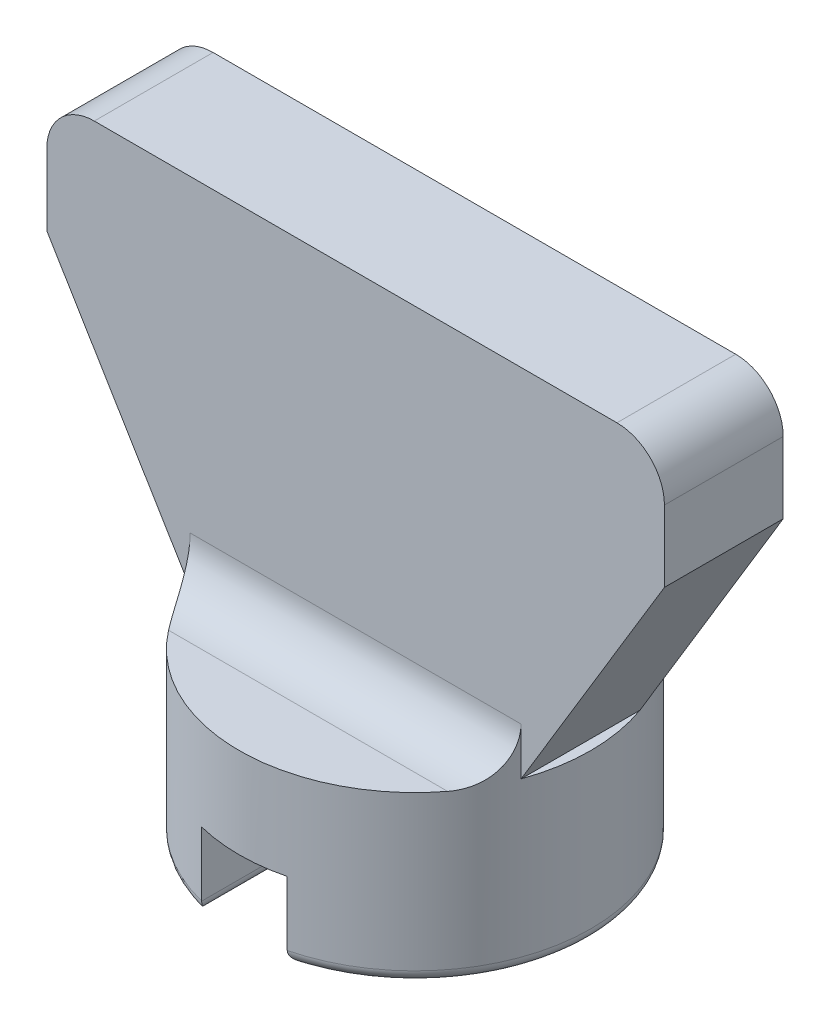
ISO-10303-21;
HEADER;
FILE_DESCRIPTION(('STEP AP214'),'2;1');
FILE_NAME('part.step','',(''),(''),'','','');
FILE_SCHEMA(('AUTOMOTIVE_DESIGN { 1 0 10303 214 1 1 1 1 }'));
ENDSEC;
DATA;
#1=APPLICATION_CONTEXT('core data for automotive mechanical design processes');
#2=APPLICATION_PROTOCOL_DEFINITION('international standard','automotive_design',2000,#1);
#3=PRODUCT_CONTEXT('',#1,'mechanical');
#4=PRODUCT('Part','Part','',(#3));
#5=PRODUCT_RELATED_PRODUCT_CATEGORY('part','',(#4));
#6=PRODUCT_DEFINITION_FORMATION('','',#4);
#7=PRODUCT_DEFINITION_CONTEXT('part definition',#1,'design');
#8=PRODUCT_DEFINITION('design','',#6,#7);
#9=PRODUCT_DEFINITION_SHAPE('','',#8);
#10=(LENGTH_UNIT() NAMED_UNIT(*) SI_UNIT(.MILLI.,.METRE.));
#11=(NAMED_UNIT(*) PLANE_ANGLE_UNIT() SI_UNIT($,.RADIAN.));
#12=(NAMED_UNIT(*) SI_UNIT($,.STERADIAN.) SOLID_ANGLE_UNIT());
#13=UNCERTAINTY_MEASURE_WITH_UNIT(LENGTH_MEASURE(1.E-05),#10,'distance_accuracy_value','');
#14=(GEOMETRIC_REPRESENTATION_CONTEXT(3) GLOBAL_UNCERTAINTY_ASSIGNED_CONTEXT((#13)) GLOBAL_UNIT_ASSIGNED_CONTEXT((#10,
#11,#12)) REPRESENTATION_CONTEXT('',''));
#15=CARTESIAN_POINT('',(0.,0.,0.));
#16=DIRECTION('',(0.,0.,1.));
#17=DIRECTION('',(1.,0.,0.));
#18=AXIS2_PLACEMENT_3D('',#15,#16,#17);
#19=CARTESIAN_POINT('',(0.,7.,0.));
#20=DIRECTION('',(0.,1.,0.));
#21=DIRECTION('',(0.,0.,1.));
#22=AXIS2_PLACEMENT_3D('',#19,#20,#21);
#23=PLANE('',#22);
#24=CARTESIAN_POINT('',(0.,7.,0.));
#25=DIRECTION('',(0.,1.,0.));
#26=DIRECTION('',(0.,0.,1.));
#27=AXIS2_PLACEMENT_3D('',#24,#25,#26);
#28=CIRCLE('',#27,7.4);
#29=CARTESIAN_POINT('',(5.87452125708981,7.,-4.5));
#30=VERTEX_POINT('',#29);
#31=CARTESIAN_POINT('',(-5.87452125708981,7.,-4.5));
#32=VERTEX_POINT('',#31);
#33=EDGE_CURVE('E260',#30,#32,#28,.T.);
#34=ORIENTED_EDGE('',*,*,#33,.T.);
#35=DIRECTION('',(-1.,0.,0.));
#36=VECTOR('',#35,1.);
#37=CARTESIAN_POINT('',(0.,7.,-4.5));
#38=LINE('',#37,#36);
#39=EDGE_CURVE('E378',#32,#30,#38,.F.);
#40=ORIENTED_EDGE('',*,*,#39,.T.);
#41=EDGE_LOOP('',(#34,#40));
#42=FACE_BOUND('',#41,.T.);
#43=ADVANCED_FACE('F39',(#42),#23,.T.);
#44=CARTESIAN_POINT('',(0.,0.,0.));
#45=DIRECTION('',(0.,1.,0.));
#46=DIRECTION('',(0.,0.,1.));
#47=AXIS2_PLACEMENT_3D('',#44,#45,#46);
#48=PLANE('',#47);
#49=CARTESIAN_POINT('',(0.,0.,0.));
#50=DIRECTION('',(0.,1.,0.));
#51=DIRECTION('',(0.,0.,1.));
#52=AXIS2_PLACEMENT_3D('',#49,#50,#51);
#53=CIRCLE('',#52,6.9);
#54=CARTESIAN_POINT('',(-2.3,0.,6.50538238691624));
#55=VERTEX_POINT('',#54);
#56=CARTESIAN_POINT('',(-2.3,0.,-6.50538238691624));
#57=VERTEX_POINT('',#56);
#58=EDGE_CURVE('E266',#55,#57,#53,.F.);
#59=ORIENTED_EDGE('',*,*,#58,.T.);
#60=DIRECTION('',(0.,0.,1.));
#61=VECTOR('',#60,1.);
#62=CARTESIAN_POINT('',(-2.3,0.,0.));
#63=LINE('',#62,#61);
#64=EDGE_CURVE('E269',#57,#55,#63,.T.);
#65=ORIENTED_EDGE('',*,*,#64,.T.);
#66=EDGE_LOOP('',(#59,#65));
#67=FACE_BOUND('',#66,.T.);
#68=ADVANCED_FACE('F426',(#67),#48,.F.);
#69=CARTESIAN_POINT('',(0.,7.,0.));
#70=DIRECTION('',(0.,-1.,0.));
#71=DIRECTION('',(0.,0.,-1.));
#72=AXIS2_PLACEMENT_3D('',#69,#70,#71);
#73=CYLINDRICAL_SURFACE('',#72,7.4);
#74=DIRECTION('',(0.,-1.,0.));
#75=VECTOR('',#74,1.);
#76=CARTESIAN_POINT('',(1.8,7.,7.17774337797054));
#77=LINE('',#76,#75);
#78=CARTESIAN_POINT('',(1.8,3.2,7.17774337797054));
#79=VERTEX_POINT('',#78);
#80=CARTESIAN_POINT('',(1.8,0.5,7.17774337797054));
#81=VERTEX_POINT('',#80);
#82=EDGE_CURVE('E243',#79,#81,#77,.T.);
#83=ORIENTED_EDGE('',*,*,#82,.T.);
#84=CARTESIAN_POINT('',(0.,0.5,0.));
#85=DIRECTION('',(0.,1.,0.));
#86=DIRECTION('',(0.,0.,1.));
#87=AXIS2_PLACEMENT_3D('',#84,#85,#86);
#88=CIRCLE('',#87,7.4);
#89=CARTESIAN_POINT('',(1.8,0.5,-7.17774337797054));
#90=VERTEX_POINT('',#89);
#91=EDGE_CURVE('E291',#81,#90,#88,.T.);
#92=ORIENTED_EDGE('',*,*,#91,.T.);
#93=DIRECTION('',(0.,-1.,0.));
#94=VECTOR('',#93,1.);
#95=CARTESIAN_POINT('',(1.8,7.,-7.17774337797054));
#96=LINE('',#95,#94);
#97=CARTESIAN_POINT('',(1.8,3.2,-7.17774337797054));
#98=VERTEX_POINT('',#97);
#99=EDGE_CURVE('E240',#90,#98,#96,.F.);
#100=ORIENTED_EDGE('',*,*,#99,.T.);
#101=CARTESIAN_POINT('',(0.,3.2,0.));
#102=DIRECTION('',(0.,-1.,0.));
#103=DIRECTION('',(0.,0.,-1.));
#104=AXIS2_PLACEMENT_3D('',#101,#102,#103);
#105=CIRCLE('',#104,7.4);
#106=CARTESIAN_POINT('',(-1.8,3.2,-7.17774337797054));
#107=VERTEX_POINT('',#106);
#108=EDGE_CURVE('E259',#107,#98,#105,.T.);
#109=ORIENTED_EDGE('',*,*,#108,.F.);
#110=DIRECTION('',(0.,-1.,0.));
#111=VECTOR('',#110,1.);
#112=CARTESIAN_POINT('',(-1.8,7.,-7.17774337797054));
#113=LINE('',#112,#111);
#114=CARTESIAN_POINT('',(-1.8,0.5,-7.17774337797054));
#115=VERTEX_POINT('',#114);
#116=EDGE_CURVE('E250',#107,#115,#113,.T.);
#117=ORIENTED_EDGE('',*,*,#116,.T.);
#118=CARTESIAN_POINT('',(0.,0.5,0.));
#119=DIRECTION('',(0.,1.,0.));
#120=DIRECTION('',(0.,0.,1.));
#121=AXIS2_PLACEMENT_3D('',#118,#119,#120);
#122=CIRCLE('',#121,7.4);
#123=CARTESIAN_POINT('',(-1.8,0.5,7.17774337797054));
#124=VERTEX_POINT('',#123);
#125=EDGE_CURVE('E288',#115,#124,#122,.T.);
#126=ORIENTED_EDGE('',*,*,#125,.T.);
#127=DIRECTION('',(0.,-1.,0.));
#128=VECTOR('',#127,1.);
#129=CARTESIAN_POINT('',(-1.8,7.,7.17774337797054));
#130=LINE('',#129,#128);
#131=CARTESIAN_POINT('',(-1.8,3.2,7.17774337797054));
#132=VERTEX_POINT('',#131);
#133=EDGE_CURVE('E247',#124,#132,#130,.F.);
#134=ORIENTED_EDGE('',*,*,#133,.T.);
#135=EDGE_CURVE('E265',#79,#132,#105,.T.);
#136=ORIENTED_EDGE('',*,*,#135,.F.);
#137=EDGE_LOOP('',(#83,#92,#100,#109,#117,#126,#134,#136));
#138=FACE_BOUND('',#137,.T.);
#139=CARTESIAN_POINT('',(6.96491205974633,7.,2.5));
#140=VERTEX_POINT('',#139);
#141=CARTESIAN_POINT('',(6.96491205974634,7.,-2.5));
#142=VERTEX_POINT('',#141);
#143=EDGE_CURVE('E255',#140,#142,#28,.T.);
#144=ORIENTED_EDGE('',*,*,#143,.F.);
#145=DIRECTION('',(0.,-1.,0.));
#146=VECTOR('',#145,1.);
#147=CARTESIAN_POINT('',(6.96491205974634,9.,2.5));
#148=LINE('',#147,#146);
#149=CARTESIAN_POINT('',(6.96491205974634,9.,2.5));
#150=VERTEX_POINT('',#149);
#151=EDGE_CURVE('E386',#150,#140,#148,.T.);
#152=ORIENTED_EDGE('',*,*,#151,.F.);
#153=CARTESIAN_POINT('',(6.96491205974634,9.,2.5));
#154=CARTESIAN_POINT('',(6.96490988978013,8.94675930102622,2.49999324196655));
#155=CARTESIAN_POINT('',(6.96414888439135,8.89352122674711,2.50212584481326));
#156=CARTESIAN_POINT('',(6.96109422611455,8.7874315823194,2.51061834560592));
#157=CARTESIAN_POINT('',(6.95880069166677,8.73457998262151,2.51697791687394));
#158=CARTESIAN_POINT('',(6.95267052696719,8.62971358798291,2.53386048338014));
#159=CARTESIAN_POINT('',(6.94883617761764,8.57769767380806,2.54437732414731));
#160=CARTESIAN_POINT('',(6.93960012029549,8.47480906857302,2.56946049103761));
#161=CARTESIAN_POINT('',(6.93419842630519,8.42393636731859,2.58402678103552));
#162=CARTESIAN_POINT('',(6.91558365363915,8.27353525793228,2.63362281453332));
#163=CARTESIAN_POINT('',(6.89995774589194,8.17616810758799,2.67455881596779));
#164=CARTESIAN_POINT('',(6.86199335441583,7.99014245719123,2.77050334281339));
#165=CARTESIAN_POINT('',(6.8396549130166,7.90148390222647,2.82551177948252));
#166=CARTESIAN_POINT('',(6.78778017756616,7.7342959734019,2.94796316639501));
#167=CARTESIAN_POINT('',(6.75818136041623,7.65586417083466,3.01551281677794));
#168=CARTESIAN_POINT('',(6.69184414332996,7.51178591818151,3.15998829325583));
#169=CARTESIAN_POINT('',(6.65510744864724,7.44613642186134,3.23691187826532));
#170=CARTESIAN_POINT('',(6.57294844097474,7.32595769934133,3.40074974361043));
#171=CARTESIAN_POINT('',(6.52721800484832,7.27203585928601,3.48795294856934));
#172=CARTESIAN_POINT('',(6.42864395144979,7.17918791628063,3.6664611399044));
#173=CARTESIAN_POINT('',(6.37578676850216,7.14029097256464,3.75777372200824));
#174=CARTESIAN_POINT('',(6.28655323023605,7.08990496054369,3.9042759709517));
#175=CARTESIAN_POINT('',(6.25216766895552,7.07369509453945,3.95912415159776));
#176=CARTESIAN_POINT('',(6.18136082946984,7.04622182956156,4.06878772350242));
#177=CARTESIAN_POINT('',(6.14493873277212,7.03496043574412,4.12360309249762));
#178=CARTESIAN_POINT('',(6.07041663941957,7.01719892934642,4.23253795558525));
#179=CARTESIAN_POINT('',(6.03232351036068,7.01068096872967,4.2866592975408));
#180=CARTESIAN_POINT('',(5.95456240759327,7.00208339574914,4.39404147764273));
#181=CARTESIAN_POINT('',(5.91489598385101,6.99999952049798,4.44730309337563));
#182=CARTESIAN_POINT('',(5.87452125708981,7.,4.5));
#183=B_SPLINE_CURVE_WITH_KNOTS('',3,(#153,#154,#155,#156,#157,#158,#159,#160,#161,#162,#163,
#164,#165,#166,#167,#168,#169,#170,#171,#172,#173,#174,#175,#176,#177,#178,#179,#180,#181,#182),
.UNSPECIFIED.,.F.,.F.,(4,2,2,2,2,2,2,2,2,2,2,2,2,2,4),(0.,0.159669295122695,0.319326251763545,
0.478747730250413,0.638167786580154,0.956840362260378,1.27551092841289,1.59702851878191,
1.91846939217174,2.25388204014957,2.58994240092548,2.78995410546787,2.99004678160974,
3.18938262387402,3.38852673981185),.UNSPECIFIED.);
#184=CARTESIAN_POINT('',(5.87452125708981,7.,4.5));
#185=VERTEX_POINT('',#184);
#186=EDGE_CURVE('E54',#150,#185,#183,.T.);
#187=ORIENTED_EDGE('',*,*,#186,.T.);
#188=CARTESIAN_POINT('',(-5.87452125708981,7.,4.5));
#189=VERTEX_POINT('',#188);
#190=EDGE_CURVE('E254',#189,#185,#28,.T.);
#191=ORIENTED_EDGE('',*,*,#190,.F.);
#192=CARTESIAN_POINT('',(-5.87452125708981,7.,4.5));
#193=CARTESIAN_POINT('',(-5.91796801386442,6.9999991834551,4.44329639671849));
#194=CARTESIAN_POINT('',(-5.96059472769925,7.00241245073197,4.38593469153333));
#195=CARTESIAN_POINT('',(-6.04401764826374,7.01239231594789,4.27023545658228));
#196=CARTESIAN_POINT('',(-6.08481160948166,7.0199650611686,4.21189684384249));
#197=CARTESIAN_POINT('',(-6.16445491991691,7.0406376071566,4.09445431836809));
#198=CARTESIAN_POINT('',(-6.20329455320997,7.05376245439857,4.03534812891109));
#199=CARTESIAN_POINT('',(-6.27855603918139,7.08581073538654,3.91722414561329));
#200=CARTESIAN_POINT('',(-6.31497908449994,7.10473128253491,3.8582063224322));
#201=CARTESIAN_POINT('',(-6.40923167392326,7.16365035216726,3.70066902879307));
#202=CARTESIAN_POINT('',(-6.46468103813618,7.20921724343025,3.6027154132706));
#203=CARTESIAN_POINT('',(-6.56704834782756,7.31790910273603,3.41255572522256));
#204=CARTESIAN_POINT('',(-6.61398556238313,7.38099357464982,3.3203369898363));
#205=CARTESIAN_POINT('',(-6.69915586471784,7.52459864492555,3.14497550815573));
#206=CARTESIAN_POINT('',(-6.73734199747061,7.60520897971785,3.06188291398103));
#207=CARTESIAN_POINT('',(-6.80456721698494,7.78191638891899,2.90943979177736));
#208=CARTESIAN_POINT('',(-6.83360240146494,7.87802004388355,2.84009513100693));
#209=CARTESIAN_POINT('',(-6.88064974994819,8.07386917782467,2.72401451246059));
#210=CARTESIAN_POINT('',(-6.8993933443719,8.17259669956638,2.67585027903208));
#211=CARTESIAN_POINT('',(-6.92977272952859,8.3775258863395,2.59616695046479));
#212=CARTESIAN_POINT('',(-6.94141578958072,8.48371978283386,2.56463083643971));
#213=CARTESIAN_POINT('',(-6.95477599411233,8.65894027581597,2.52810352734734));
#214=CARTESIAN_POINT('',(-6.95858484642658,8.72671023114583,2.517576407376));
#215=CARTESIAN_POINT('',(-6.96364741761588,8.86297562887335,2.50352395879054));
#216=CARTESIAN_POINT('',(-6.96490450804284,8.93146999362211,2.49998939132345));
#217=CARTESIAN_POINT('',(-6.96491205974634,9.,2.5));
#218=B_SPLINE_CURVE_WITH_KNOTS('',3,(#192,#193,#194,#195,#196,#197,#198,#199,#200,#201,#202,
#203,#204,#205,#206,#207,#208,#209,#210,#211,#212,#213,#214,#215,#216,#217),.UNSPECIFIED.,.F.,
.F.,(4,2,2,2,2,2,2,2,2,2,2,2,4),(0.,0.214290136274398,0.428836036946061,0.644360289173684,
0.859777371770655,1.22239928142621,1.58418978323103,1.94787829469435,2.31172168635833,
2.64438332701008,2.97670382417658,3.18239372982334,3.38781168737558),.UNSPECIFIED.);
#219=CARTESIAN_POINT('',(-6.96491205974634,9.,2.5));
#220=VERTEX_POINT('',#219);
#221=EDGE_CURVE('E11',#189,#220,#218,.T.);
#222=ORIENTED_EDGE('',*,*,#221,.T.);
#223=DIRECTION('',(0.,-1.,0.));
#224=VECTOR('',#223,1.);
#225=CARTESIAN_POINT('',(-6.96491205974634,7.,2.5));
#226=LINE('',#225,#224);
#227=CARTESIAN_POINT('',(-6.96491205974634,7.,2.5));
#228=VERTEX_POINT('',#227);
#229=EDGE_CURVE('E60',#228,#220,#226,.F.);
#230=ORIENTED_EDGE('',*,*,#229,.F.);
#231=CARTESIAN_POINT('',(-6.96491205974634,7.,-2.5));
#232=VERTEX_POINT('',#231);
#233=EDGE_CURVE('E261',#232,#228,#28,.T.);
#234=ORIENTED_EDGE('',*,*,#233,.F.);
#235=DIRECTION('',(0.,-1.,0.));
#236=VECTOR('',#235,1.);
#237=CARTESIAN_POINT('',(-6.96491205974634,9.,-2.5));
#238=LINE('',#237,#236);
#239=CARTESIAN_POINT('',(-6.96491205974634,9.,-2.5));
#240=VERTEX_POINT('',#239);
#241=EDGE_CURVE('E375',#240,#232,#238,.T.);
#242=ORIENTED_EDGE('',*,*,#241,.F.);
#243=CARTESIAN_POINT('',(-6.96491205974634,9.,-2.5));
#244=CARTESIAN_POINT('',(-6.96490988978013,8.94675930102622,-2.49999324196655));
#245=CARTESIAN_POINT('',(-6.96414888439135,8.89352122674711,-2.50212584481326));
#246=CARTESIAN_POINT('',(-6.96109422611455,8.7874315823194,-2.51061834560592));
#247=CARTESIAN_POINT('',(-6.95880069166677,8.73457998262151,-2.51697791687394));
#248=CARTESIAN_POINT('',(-6.95267052696719,8.62971358798291,-2.53386048338014));
#249=CARTESIAN_POINT('',(-6.94883617761764,8.57769767380806,-2.54437732414731));
#250=CARTESIAN_POINT('',(-6.93960012029549,8.47480906857302,-2.56946049103761));
#251=CARTESIAN_POINT('',(-6.93419842630519,8.42393636731859,-2.58402678103552));
#252=CARTESIAN_POINT('',(-6.91558365363915,8.27353525793228,-2.63362281453332));
#253=CARTESIAN_POINT('',(-6.89995774589194,8.17616810758799,-2.67455881596779));
#254=CARTESIAN_POINT('',(-6.86199335441583,7.99014245719123,-2.77050334281339));
#255=CARTESIAN_POINT('',(-6.8396549130166,7.90148390222647,-2.82551177948252));
#256=CARTESIAN_POINT('',(-6.78778017756616,7.7342959734019,-2.94796316639501));
#257=CARTESIAN_POINT('',(-6.75818136041623,7.65586417083466,-3.01551281677794));
#258=CARTESIAN_POINT('',(-6.69184414332996,7.51178591818151,-3.15998829325583));
#259=CARTESIAN_POINT('',(-6.65510744864724,7.44613642186134,-3.23691187826532));
#260=CARTESIAN_POINT('',(-6.57294844097474,7.32595769934133,-3.40074974361043));
#261=CARTESIAN_POINT('',(-6.52721800484832,7.27203585928601,-3.48795294856934));
#262=CARTESIAN_POINT('',(-6.42864395144979,7.17918791628063,-3.6664611399044));
#263=CARTESIAN_POINT('',(-6.37578676850216,7.14029097256464,-3.75777372200824));
#264=CARTESIAN_POINT('',(-6.28655323023605,7.08990496054369,-3.9042759709517));
#265=CARTESIAN_POINT('',(-6.25216766895552,7.07369509453945,-3.95912415159776));
#266=CARTESIAN_POINT('',(-6.18136082946984,7.04622182956156,-4.06878772350242));
#267=CARTESIAN_POINT('',(-6.14493873277212,7.03496043574412,-4.12360309249762));
#268=CARTESIAN_POINT('',(-6.07041663941957,7.01719892934642,-4.23253795558525));
#269=CARTESIAN_POINT('',(-6.03232351036068,7.01068096872967,-4.2866592975408));
#270=CARTESIAN_POINT('',(-5.95456240759327,7.00208339574914,-4.39404147764273));
#271=CARTESIAN_POINT('',(-5.91489598385101,6.99999952049798,-4.44730309337563));
#272=CARTESIAN_POINT('',(-5.87452125708981,7.,-4.5));
#273=B_SPLINE_CURVE_WITH_KNOTS('',3,(#243,#244,#245,#246,#247,#248,#249,#250,#251,#252,#253,
#254,#255,#256,#257,#258,#259,#260,#261,#262,#263,#264,#265,#266,#267,#268,#269,#270,#271,#272),
.UNSPECIFIED.,.F.,.F.,(4,2,2,2,2,2,2,2,2,2,2,2,2,2,4),(0.,0.159669295122695,0.319326251763545,
0.478747730250413,0.638167786580154,0.956840362260378,1.27551092841289,1.59702851878191,
1.91846939217174,2.25388204014957,2.58994240092548,2.78995410546787,2.99004678160974,
3.18938262387402,3.38852673981185),.UNSPECIFIED.);
#274=EDGE_CURVE('E392',#240,#32,#273,.T.);
#275=ORIENTED_EDGE('',*,*,#274,.T.);
#276=ORIENTED_EDGE('',*,*,#33,.F.);
#277=CARTESIAN_POINT('',(5.87452125708981,7.,-4.5));
#278=CARTESIAN_POINT('',(5.91796801386442,6.9999991834551,-4.44329639671849));
#279=CARTESIAN_POINT('',(5.96059472769925,7.00241245073197,-4.38593469153333));
#280=CARTESIAN_POINT('',(6.04401764826374,7.01239231594789,-4.27023545658228));
#281=CARTESIAN_POINT('',(6.08481160948166,7.0199650611686,-4.21189684384249));
#282=CARTESIAN_POINT('',(6.16445491991691,7.0406376071566,-4.09445431836809));
#283=CARTESIAN_POINT('',(6.20329455320997,7.05376245439857,-4.03534812891109));
#284=CARTESIAN_POINT('',(6.27855603918139,7.08581073538654,-3.91722414561329));
#285=CARTESIAN_POINT('',(6.31497908449994,7.10473128253491,-3.8582063224322));
#286=CARTESIAN_POINT('',(6.40923167392326,7.16365035216726,-3.70066902879307));
#287=CARTESIAN_POINT('',(6.46468103813618,7.20921724343025,-3.6027154132706));
#288=CARTESIAN_POINT('',(6.56704834782756,7.31790910273603,-3.41255572522256));
#289=CARTESIAN_POINT('',(6.61398556238313,7.38099357464982,-3.3203369898363));
#290=CARTESIAN_POINT('',(6.69915586471784,7.52459864492555,-3.14497550815573));
#291=CARTESIAN_POINT('',(6.73734199747061,7.60520897971785,-3.06188291398103));
#292=CARTESIAN_POINT('',(6.80456721698494,7.78191638891899,-2.90943979177736));
#293=CARTESIAN_POINT('',(6.83360240146494,7.87802004388355,-2.84009513100693));
#294=CARTESIAN_POINT('',(6.88064974994819,8.07386917782467,-2.72401451246059));
#295=CARTESIAN_POINT('',(6.8993933443719,8.17259669956638,-2.67585027903208));
#296=CARTESIAN_POINT('',(6.92977272952859,8.3775258863395,-2.59616695046479));
#297=CARTESIAN_POINT('',(6.94141578958072,8.48371978283386,-2.56463083643971));
#298=CARTESIAN_POINT('',(6.95477599411233,8.65894027581597,-2.52810352734734));
#299=CARTESIAN_POINT('',(6.95858484642658,8.72671023114583,-2.517576407376));
#300=CARTESIAN_POINT('',(6.96364741761588,8.86297562887335,-2.50352395879054));
#301=CARTESIAN_POINT('',(6.96490450804284,8.93146999362211,-2.49998939132345));
#302=CARTESIAN_POINT('',(6.96491205974634,9.,-2.5));
#303=B_SPLINE_CURVE_WITH_KNOTS('',3,(#277,#278,#279,#280,#281,#282,#283,#284,#285,#286,#287,
#288,#289,#290,#291,#292,#293,#294,#295,#296,#297,#298,#299,#300,#301,#302),.UNSPECIFIED.,.F.,
.F.,(4,2,2,2,2,2,2,2,2,2,2,2,4),(0.,0.214290136274398,0.428836036946061,0.644360289173684,
0.859777371770655,1.22239928142621,1.58418978323103,1.94787829469435,2.31172168635833,
2.64438332701008,2.97670382417658,3.18239372982334,3.38781168737558),.UNSPECIFIED.);
#304=CARTESIAN_POINT('',(6.96491205974634,9.,-2.5));
#305=VERTEX_POINT('',#304);
#306=EDGE_CURVE('E399',#30,#305,#303,.T.);
#307=ORIENTED_EDGE('',*,*,#306,.T.);
#308=DIRECTION('',(0.,-1.,0.));
#309=VECTOR('',#308,1.);
#310=CARTESIAN_POINT('',(6.96491205974634,7.,-2.5));
#311=LINE('',#310,#309);
#312=EDGE_CURVE('E67',#142,#305,#311,.F.);
#313=ORIENTED_EDGE('',*,*,#312,.F.);
#314=EDGE_LOOP('',(#144,#152,#187,#191,#222,#230,#234,#242,#275,#276,#307,#313));
#315=FACE_BOUND('',#314,.T.);
#316=ADVANCED_FACE('F404',(#138,#315),#73,.T.);
#317=ORIENTED_EDGE('',*,*,#190,.T.);
#318=DIRECTION('',(1.,0.,0.));
#319=VECTOR('',#318,1.);
#320=CARTESIAN_POINT('',(0.,7.,4.5));
#321=LINE('',#320,#319);
#322=EDGE_CURVE('E389',#185,#189,#321,.F.);
#323=ORIENTED_EDGE('',*,*,#322,.T.);
#324=EDGE_LOOP('',(#317,#323));
#325=FACE_BOUND('',#324,.T.);
#326=ADVANCED_FACE('F429',(#325),#23,.T.);
#327=CARTESIAN_POINT('',(0.,0.,0.));
#328=DIRECTION('',(0.,1.,0.));
#329=DIRECTION('',(0.,0.,1.));
#330=AXIS2_PLACEMENT_3D('',#327,#328,#329);
#331=CIRCLE('',#330,6.9);
#332=CARTESIAN_POINT('',(2.3,0.,-6.50538238691624));
#333=VERTEX_POINT('',#332);
#334=CARTESIAN_POINT('',(2.3,0.,6.50538238691624));
#335=VERTEX_POINT('',#334);
#336=EDGE_CURVE('E277',#333,#335,#331,.F.);
#337=ORIENTED_EDGE('',*,*,#336,.T.);
#338=DIRECTION('',(0.,0.,-1.));
#339=VECTOR('',#338,1.);
#340=CARTESIAN_POINT('',(2.3,0.,0.));
#341=LINE('',#340,#339);
#342=EDGE_CURVE('E280',#335,#333,#341,.T.);
#343=ORIENTED_EDGE('',*,*,#342,.T.);
#344=EDGE_LOOP('',(#337,#343));
#345=FACE_BOUND('',#344,.T.);
#346=ADVANCED_FACE('F434',(#345),#48,.F.);
#347=CARTESIAN_POINT('',(0.,3.2,0.));
#348=DIRECTION('',(0.,-1.,0.));
#349=DIRECTION('',(0.,0.,-1.));
#350=AXIS2_PLACEMENT_3D('',#347,#348,#349);
#351=PLANE('',#350);
#352=ORIENTED_EDGE('',*,*,#135,.T.);
#353=DIRECTION('',(0.,0.,-1.));
#354=VECTOR('',#353,1.);
#355=CARTESIAN_POINT('',(-1.8,3.2,8.0374463788754));
#356=LINE('',#355,#354);
#357=EDGE_CURVE('E231',#132,#107,#356,.T.);
#358=ORIENTED_EDGE('',*,*,#357,.T.);
#359=ORIENTED_EDGE('',*,*,#108,.T.);
#360=DIRECTION('',(0.,0.,1.));
#361=VECTOR('',#360,1.);
#362=CARTESIAN_POINT('',(1.8,3.2,8.0374463788754));
#363=LINE('',#362,#361);
#364=EDGE_CURVE('E235',#98,#79,#363,.T.);
#365=ORIENTED_EDGE('',*,*,#364,.T.);
#366=EDGE_LOOP('',(#352,#358,#359,#365));
#367=FACE_BOUND('',#366,.T.);
#368=ADVANCED_FACE('F443',(#367),#351,.T.);
#369=CARTESIAN_POINT('',(-1.8,3.2,8.0374463788754));
#370=DIRECTION('',(-1.,0.,0.));
#371=DIRECTION('',(0.,0.,1.));
#372=AXIS2_PLACEMENT_3D('',#369,#370,#371);
#373=PLANE('',#372);
#374=ORIENTED_EDGE('',*,*,#133,.F.);
#375=DIRECTION('',(0.,0.,1.));
#376=VECTOR('',#375,1.);
#377=CARTESIAN_POINT('',(-1.8,0.5,8.0374463788754));
#378=LINE('',#377,#376);
#379=EDGE_CURVE('E273',#124,#115,#378,.F.);
#380=ORIENTED_EDGE('',*,*,#379,.T.);
#381=ORIENTED_EDGE('',*,*,#116,.F.);
#382=ORIENTED_EDGE('',*,*,#357,.F.);
#383=EDGE_LOOP('',(#374,#380,#381,#382));
#384=FACE_BOUND('',#383,.T.);
#385=ADVANCED_FACE('F498',(#384),#373,.F.);
#386=CARTESIAN_POINT('',(1.8,3.2,8.0374463788754));
#387=DIRECTION('',(1.,0.,0.));
#388=DIRECTION('',(0.,0.,-1.));
#389=AXIS2_PLACEMENT_3D('',#386,#387,#388);
#390=PLANE('',#389);
#391=ORIENTED_EDGE('',*,*,#99,.F.);
#392=DIRECTION('',(0.,0.,-1.));
#393=VECTOR('',#392,1.);
#394=CARTESIAN_POINT('',(1.8,0.5,8.0374463788754));
#395=LINE('',#394,#393);
#396=EDGE_CURVE('E284',#90,#81,#395,.F.);
#397=ORIENTED_EDGE('',*,*,#396,.T.);
#398=ORIENTED_EDGE('',*,*,#82,.F.);
#399=ORIENTED_EDGE('',*,*,#364,.F.);
#400=EDGE_LOOP('',(#391,#397,#398,#399));
#401=FACE_BOUND('',#400,.T.);
#402=ADVANCED_FACE('F316',(#401),#390,.F.);
#403=CARTESIAN_POINT('',(0.,0.5,0.));
#404=DIRECTION('',(0.,1.,0.));
#405=DIRECTION('',(0.,0.,1.));
#406=AXIS2_PLACEMENT_3D('',#403,#404,#405);
#407=TOROIDAL_SURFACE('',#406,6.9,0.5);
#408=CARTESIAN_POINT('',(-1.8,0.5,7.17774337797054));
#409=CARTESIAN_POINT('',(-1.79996099619526,0.479244253497925,7.1777915470728));
#410=CARTESIAN_POINT('',(-1.80128974707324,0.458564245434219,7.17609034804468));
#411=CARTESIAN_POINT('',(-1.80633010227469,0.4182207503747,7.16962641330162));
#412=CARTESIAN_POINT('',(-1.8100144487914,0.398548380569583,7.16489869817358));
#413=CARTESIAN_POINT('',(-1.81940803160352,0.360662810524451,7.15282642642886));
#414=CARTESIAN_POINT('',(-1.82510888827748,0.342443948506235,7.14549269854457));
#415=CARTESIAN_POINT('',(-1.83812919234911,0.307588753293909,7.12870915844284));
#416=CARTESIAN_POINT('',(-1.84545349314725,0.290957383934168,7.11925299997664));
#417=CARTESIAN_POINT('',(-1.86543377874319,0.251262897760324,7.09339539953549));
#418=CARTESIAN_POINT('',(-1.87889212645429,0.22930267413956,7.07592624095862));
#419=CARTESIAN_POINT('',(-1.90764118331982,0.189085812389894,7.03844849651268));
#420=CARTESIAN_POINT('',(-1.92293579809843,0.170837298976136,7.01843449238235));
#421=CARTESIAN_POINT('',(-1.96395313486751,0.127982171468994,6.96450614968511));
#422=CARTESIAN_POINT('',(-1.99055749560738,0.105870198762608,6.92928978886352));
#423=CARTESIAN_POINT('',(-2.04516023515169,0.0685478740345926,6.85641249851014));
#424=CARTESIAN_POINT('',(-2.07316141113824,0.0533520424142022,6.81874661384666));
#425=CARTESIAN_POINT('',(-2.13384402670446,0.0270962960082887,6.73640850616222));
#426=CARTESIAN_POINT('',(-2.1666145767938,0.0169575726213458,6.69151320387429));
#427=CARTESIAN_POINT('',(-2.2321218904664,0.00350529187784368,6.60083414412866));
#428=CARTESIAN_POINT('',(-2.26485860858889,0.000179474020963785,6.55505213259642));
#429=CARTESIAN_POINT('',(-2.29822708502071,2.36734961008698E-06,6.50788930675039));
#430=CARTESIAN_POINT('',(-2.2991136402507,1.10354455115264E-08,6.50663589072227));
#431=CARTESIAN_POINT('',(-2.3,0.,6.50538238691624));
#432=B_SPLINE_CURVE_WITH_KNOTS('',3,(#408,#409,#410,#411,#412,#413,#414,#415,#416,#417,#418,
#419,#420,#421,#422,#423,#424,#425,#426,#427,#428,#429,#430,#431),.UNSPECIFIED.,.F.,.F.,(4,2,2,
2,2,2,2,2,2,2,2,4),(0.,0.062035265181198,0.123365369706317,0.184443554082017,0.245706859707081,
0.338544736055139,0.431583692433389,0.578857781507444,0.726439661355672,0.895455297283458,
1.06416650462435,1.06877228945091),.UNSPECIFIED.);
#433=EDGE_CURVE('E295',#124,#55,#432,.T.);
#434=ORIENTED_EDGE('',*,*,#433,.F.);
#435=ORIENTED_EDGE('',*,*,#125,.F.);
#436=CARTESIAN_POINT('',(-1.8,0.5,-7.17774337797054));
#437=CARTESIAN_POINT('',(-1.79996099619526,0.479244253497925,-7.1777915470728));
#438=CARTESIAN_POINT('',(-1.80128974707324,0.458564245434219,-7.17609034804468));
#439=CARTESIAN_POINT('',(-1.80633010227469,0.4182207503747,-7.16962641330162));
#440=CARTESIAN_POINT('',(-1.8100144487914,0.398548380569583,-7.16489869817358));
#441=CARTESIAN_POINT('',(-1.81940803160352,0.360662810524451,-7.15282642642886));
#442=CARTESIAN_POINT('',(-1.82510888827748,0.342443948506235,-7.14549269854457));
#443=CARTESIAN_POINT('',(-1.83812919234911,0.307588753293909,-7.12870915844284));
#444=CARTESIAN_POINT('',(-1.84545349314725,0.290957383934168,-7.11925299997664));
#445=CARTESIAN_POINT('',(-1.86543377874319,0.251262897760324,-7.09339539953549));
#446=CARTESIAN_POINT('',(-1.87889212645429,0.22930267413956,-7.07592624095862));
#447=CARTESIAN_POINT('',(-1.90764118331982,0.189085812389893,-7.03844849651268));
#448=CARTESIAN_POINT('',(-1.92293579809842,0.170837298976136,-7.01843449238235));
#449=CARTESIAN_POINT('',(-1.96395313486751,0.127982171468995,-6.96450614968512));
#450=CARTESIAN_POINT('',(-1.99055749560737,0.105870198762609,-6.92928978886352));
#451=CARTESIAN_POINT('',(-2.04516023515169,0.0685478740345935,-6.85641249851014));
#452=CARTESIAN_POINT('',(-2.07316141113823,0.053352042414203,-6.81874661384666));
#453=CARTESIAN_POINT('',(-2.13384402670446,0.0270962960082892,-6.73640850616222));
#454=CARTESIAN_POINT('',(-2.1666145767938,0.0169575726213461,-6.6915132038743));
#455=CARTESIAN_POINT('',(-2.2321218904664,0.00350529187784391,-6.60083414412866));
#456=CARTESIAN_POINT('',(-2.26485860858889,0.000179474020964256,-6.55505213259643));
#457=CARTESIAN_POINT('',(-2.29822708502071,2.36734961011102E-06,-6.50788930675039));
#458=CARTESIAN_POINT('',(-2.2991136402507,1.10354455232156E-08,-6.50663589072227));
#459=CARTESIAN_POINT('',(-2.3,0.,-6.50538238691624));
#460=B_SPLINE_CURVE_WITH_KNOTS('',3,(#436,#437,#438,#439,#440,#441,#442,#443,#444,#445,#446,
#447,#448,#449,#450,#451,#452,#453,#454,#455,#456,#457,#458,#459),.UNSPECIFIED.,.F.,.F.,(4,2,2,
2,2,2,2,2,2,2,2,4),(0.,0.0620352651811981,0.123365369706317,0.184443554082017,0.245706859707081,
0.33854473605514,0.431583692433388,0.578857781507441,0.726439661355669,0.895455297283455,
1.06416650462435,1.06877228945091),.UNSPECIFIED.);
#461=EDGE_CURVE('E236',#57,#115,#460,.F.);
#462=ORIENTED_EDGE('',*,*,#461,.F.);
#463=ORIENTED_EDGE('',*,*,#58,.F.);
#464=EDGE_LOOP('',(#434,#435,#462,#463));
#465=FACE_BOUND('',#464,.T.);
#466=ADVANCED_FACE('F312',(#465),#407,.T.);
#467=CARTESIAN_POINT('',(-2.3,0.5,0.));
#468=DIRECTION('',(0.,0.,1.));
#469=DIRECTION('',(1.,0.,0.));
#470=AXIS2_PLACEMENT_3D('',#467,#468,#469);
#471=CYLINDRICAL_SURFACE('',#470,0.5);
#472=ORIENTED_EDGE('',*,*,#461,.T.);
#473=ORIENTED_EDGE('',*,*,#379,.F.);
#474=ORIENTED_EDGE('',*,*,#433,.T.);
#475=ORIENTED_EDGE('',*,*,#64,.F.);
#476=EDGE_LOOP('',(#472,#473,#474,#475));
#477=FACE_BOUND('',#476,.T.);
#478=ADVANCED_FACE('F310',(#477),#471,.T.);
#479=CARTESIAN_POINT('',(0.,0.5,0.));
#480=DIRECTION('',(0.,1.,0.));
#481=DIRECTION('',(0.,0.,1.));
#482=AXIS2_PLACEMENT_3D('',#479,#480,#481);
#483=TOROIDAL_SURFACE('',#482,6.9,0.5);
#484=CARTESIAN_POINT('',(1.8,0.5,-7.17774337797054));
#485=CARTESIAN_POINT('',(1.79996099619526,0.479244253497925,-7.1777915470728));
#486=CARTESIAN_POINT('',(1.80128974707324,0.458564245434219,-7.17609034804468));
#487=CARTESIAN_POINT('',(1.80633010227469,0.4182207503747,-7.16962641330162));
#488=CARTESIAN_POINT('',(1.8100144487914,0.398548380569583,-7.16489869817358));
#489=CARTESIAN_POINT('',(1.81940803160352,0.360662810524451,-7.15282642642886));
#490=CARTESIAN_POINT('',(1.82510888827748,0.342443948506235,-7.14549269854457));
#491=CARTESIAN_POINT('',(1.83812919234911,0.307588753293909,-7.12870915844284));
#492=CARTESIAN_POINT('',(1.84545349314725,0.290957383934168,-7.11925299997664));
#493=CARTESIAN_POINT('',(1.86543377874319,0.251262897760324,-7.09339539953549));
#494=CARTESIAN_POINT('',(1.87889212645429,0.22930267413956,-7.07592624095862));
#495=CARTESIAN_POINT('',(1.90764118331982,0.189085812389893,-7.03844849651268));
#496=CARTESIAN_POINT('',(1.92293579809843,0.170837298976136,-7.01843449238235));
#497=CARTESIAN_POINT('',(1.96395313486751,0.127982171468994,-6.96450614968512));
#498=CARTESIAN_POINT('',(1.99055749560737,0.105870198762609,-6.92928978886352));
#499=CARTESIAN_POINT('',(2.04516023515169,0.068547874034593,-6.85641249851014));
#500=CARTESIAN_POINT('',(2.07316141113824,0.0533520424142024,-6.81874661384666));
#501=CARTESIAN_POINT('',(2.13384402670446,0.0270962960082888,-6.73640850616221));
#502=CARTESIAN_POINT('',(2.16661457679378,0.016957572621346,-6.69151320387428));
#503=CARTESIAN_POINT('',(2.23212189046642,0.00350529187784373,-6.60083414412868));
#504=CARTESIAN_POINT('',(2.26485860858897,0.000179474020963546,-6.55505213259648));
#505=CARTESIAN_POINT('',(2.29822708502071,2.36734961007257E-06,-6.50788930675039));
#506=CARTESIAN_POINT('',(2.2991136402507,1.10354455034826E-08,-6.50663589072227));
#507=CARTESIAN_POINT('',(2.3,0.,-6.50538238691624));
#508=B_SPLINE_CURVE_WITH_KNOTS('',3,(#484,#485,#486,#487,#488,#489,#490,#491,#492,#493,#494,
#495,#496,#497,#498,#499,#500,#501,#502,#503,#504,#505,#506,#507),.UNSPECIFIED.,.F.,.F.,(4,2,2,
2,2,2,2,2,2,2,2,4),(0.,0.0620352651811979,0.123365369706317,0.184443554082017,0.245706859707081,
0.33854473605514,0.43158369243339,0.578857781507443,0.726439661355671,0.895455297283457,
1.06416650462435,1.06877228945091),.UNSPECIFIED.);
#509=EDGE_CURVE('E182',#90,#333,#508,.T.);
#510=ORIENTED_EDGE('',*,*,#509,.F.);
#511=ORIENTED_EDGE('',*,*,#91,.F.);
#512=CARTESIAN_POINT('',(1.8,0.5,7.17774337797054));
#513=CARTESIAN_POINT('',(1.79996099619526,0.479244253497925,7.1777915470728));
#514=CARTESIAN_POINT('',(1.80128974707324,0.458564245434219,7.17609034804468));
#515=CARTESIAN_POINT('',(1.80633010227469,0.4182207503747,7.16962641330162));
#516=CARTESIAN_POINT('',(1.8100144487914,0.398548380569583,7.16489869817358));
#517=CARTESIAN_POINT('',(1.81940803160352,0.360662810524451,7.15282642642886));
#518=CARTESIAN_POINT('',(1.82510888827748,0.342443948506235,7.14549269854457));
#519=CARTESIAN_POINT('',(1.83812919234911,0.30758875329391,7.12870915844284));
#520=CARTESIAN_POINT('',(1.84545349314725,0.290957383934168,7.11925299997664));
#521=CARTESIAN_POINT('',(1.86543377874319,0.251262897760325,7.09339539953549));
#522=CARTESIAN_POINT('',(1.87889212645429,0.22930267413956,7.07592624095862));
#523=CARTESIAN_POINT('',(1.90764118331982,0.189085812389894,7.03844849651268));
#524=CARTESIAN_POINT('',(1.92293579809842,0.170837298976136,7.01843449238235));
#525=CARTESIAN_POINT('',(1.96395313486751,0.127982171468995,6.96450614968512));
#526=CARTESIAN_POINT('',(1.99055749560737,0.105870198762609,6.92928978886352));
#527=CARTESIAN_POINT('',(2.04516023515169,0.0685478740345935,6.85641249851014));
#528=CARTESIAN_POINT('',(2.07316141113823,0.053352042414203,6.81874661384666));
#529=CARTESIAN_POINT('',(2.13384402670446,0.0270962960082892,6.73640850616222));
#530=CARTESIAN_POINT('',(2.1666145767938,0.0169575726213462,6.6915132038743));
#531=CARTESIAN_POINT('',(2.2321218904664,0.00350529187784382,6.60083414412866));
#532=CARTESIAN_POINT('',(2.26485860858889,0.000179474020964001,6.55505213259643));
#533=CARTESIAN_POINT('',(2.29822708502071,2.3673496100973E-06,6.50788930675039));
#534=CARTESIAN_POINT('',(2.2991136402507,1.10354455161976E-08,6.50663589072227));
#535=CARTESIAN_POINT('',(2.3,0.,6.50538238691624));
#536=B_SPLINE_CURVE_WITH_KNOTS('',3,(#512,#513,#514,#515,#516,#517,#518,#519,#520,#521,#522,
#523,#524,#525,#526,#527,#528,#529,#530,#531,#532,#533,#534,#535),.UNSPECIFIED.,.F.,.F.,(4,2,2,
2,2,2,2,2,2,2,2,4),(0.,0.0620352651811981,0.123365369706317,0.184443554082017,0.245706859707081,
0.33854473605514,0.431583692433388,0.578857781507441,0.726439661355669,0.895455297283455,
1.06416650462435,1.06877228945091),.UNSPECIFIED.);
#537=EDGE_CURVE('E304',#335,#81,#536,.F.);
#538=ORIENTED_EDGE('',*,*,#537,.F.);
#539=ORIENTED_EDGE('',*,*,#336,.F.);
#540=EDGE_LOOP('',(#510,#511,#538,#539));
#541=FACE_BOUND('',#540,.T.);
#542=ADVANCED_FACE('F323',(#541),#483,.T.);
#543=CARTESIAN_POINT('',(2.3,0.5,0.));
#544=DIRECTION('',(0.,0.,-1.));
#545=DIRECTION('',(-1.,0.,0.));
#546=AXIS2_PLACEMENT_3D('',#543,#544,#545);
#547=CYLINDRICAL_SURFACE('',#546,0.5);
#548=ORIENTED_EDGE('',*,*,#537,.T.);
#549=ORIENTED_EDGE('',*,*,#396,.F.);
#550=ORIENTED_EDGE('',*,*,#509,.T.);
#551=ORIENTED_EDGE('',*,*,#342,.F.);
#552=EDGE_LOOP('',(#548,#549,#550,#551));
#553=FACE_BOUND('',#552,.T.);
#554=ADVANCED_FACE('F318',(#553),#547,.T.);
#555=CARTESIAN_POINT('',(-13.,22.,-2.5));
#556=DIRECTION('',(1.,0.,0.));
#557=DIRECTION('',(0.,0.,-1.));
#558=AXIS2_PLACEMENT_3D('',#555,#556,#557);
#559=PLANE('',#558);
#560=DIRECTION('',(0.,-1.,0.));
#561=VECTOR('',#560,1.);
#562=CARTESIAN_POINT('',(-13.,22.,2.5));
#563=LINE('',#562,#561);
#564=CARTESIAN_POINT('',(-13.,20.,2.5));
#565=VERTEX_POINT('',#564);
#566=CARTESIAN_POINT('',(-13.,17.,2.5));
#567=VERTEX_POINT('',#566);
#568=EDGE_CURVE('E170',#565,#567,#563,.T.);
#569=ORIENTED_EDGE('',*,*,#568,.F.);
#570=DIRECTION('',(0.,0.,1.));
#571=VECTOR('',#570,1.);
#572=CARTESIAN_POINT('',(-13.,20.,-2.5));
#573=LINE('',#572,#571);
#574=CARTESIAN_POINT('',(-13.,20.,-2.5));
#575=VERTEX_POINT('',#574);
#576=EDGE_CURVE('E357',#565,#575,#573,.F.);
#577=ORIENTED_EDGE('',*,*,#576,.T.);
#578=DIRECTION('',(0.,-1.,0.));
#579=VECTOR('',#578,1.);
#580=CARTESIAN_POINT('',(-13.,22.,-2.5));
#581=LINE('',#580,#579);
#582=CARTESIAN_POINT('',(-13.,17.,-2.5));
#583=VERTEX_POINT('',#582);
#584=EDGE_CURVE('E199',#575,#583,#581,.T.);
#585=ORIENTED_EDGE('',*,*,#584,.T.);
#586=DIRECTION('',(0.,0.,1.));
#587=VECTOR('',#586,1.);
#588=CARTESIAN_POINT('',(-13.,17.,-7.4));
#589=LINE('',#588,#587);
#590=EDGE_CURVE('E189',#583,#567,#589,.T.);
#591=ORIENTED_EDGE('',*,*,#590,.T.);
#592=EDGE_LOOP('',(#569,#577,#585,#591));
#593=FACE_BOUND('',#592,.T.);
#594=ADVANCED_FACE('F197',(#593),#559,.F.);
#595=CARTESIAN_POINT('',(-13.,22.,2.5));
#596=DIRECTION('',(0.,0.,-1.));
#597=DIRECTION('',(-1.,0.,0.));
#598=AXIS2_PLACEMENT_3D('',#595,#596,#597);
#599=PLANE('',#598);
#600=DIRECTION('',(1.,0.,0.));
#601=VECTOR('',#600,1.);
#602=CARTESIAN_POINT('',(-13.,9.,2.5));
#603=LINE('',#602,#601);
#604=EDGE_CURVE('E383',#220,#150,#603,.T.);
#605=ORIENTED_EDGE('',*,*,#604,.T.);
#606=ORIENTED_EDGE('',*,*,#151,.T.);
#607=DIRECTION('',(-0.516702949653858,-0.856164739883045,0.));
#608=VECTOR('',#607,1.);
#609=CARTESIAN_POINT('',(6.96491205974633,7.,2.5));
#610=LINE('',#609,#608);
#611=CARTESIAN_POINT('',(13.,17.,2.5));
#612=VERTEX_POINT('',#611);
#613=EDGE_CURVE('E210',#612,#140,#610,.T.);
#614=ORIENTED_EDGE('',*,*,#613,.F.);
#615=DIRECTION('',(0.,-1.,0.));
#616=VECTOR('',#615,1.);
#617=CARTESIAN_POINT('',(13.,22.,2.5));
#618=LINE('',#617,#616);
#619=CARTESIAN_POINT('',(13.,20.,2.5));
#620=VERTEX_POINT('',#619);
#621=EDGE_CURVE('E183',#620,#612,#618,.T.);
#622=ORIENTED_EDGE('',*,*,#621,.F.);
#623=CARTESIAN_POINT('',(11.,20.,2.5));
#624=DIRECTION('',(0.,0.,-1.));
#625=DIRECTION('',(-1.,0.,0.));
#626=AXIS2_PLACEMENT_3D('',#623,#624,#625);
#627=CIRCLE('',#626,2.);
#628=CARTESIAN_POINT('',(11.,22.,2.5));
#629=VERTEX_POINT('',#628);
#630=EDGE_CURVE('E352',#620,#629,#627,.F.);
#631=ORIENTED_EDGE('',*,*,#630,.T.);
#632=DIRECTION('',(1.,0.,0.));
#633=VECTOR('',#632,1.);
#634=CARTESIAN_POINT('',(-13.,22.,2.5));
#635=LINE('',#634,#633);
#636=CARTESIAN_POINT('',(-11.,22.,2.5));
#637=VERTEX_POINT('',#636);
#638=EDGE_CURVE('E201',#637,#629,#635,.T.);
#639=ORIENTED_EDGE('',*,*,#638,.F.);
#640=CARTESIAN_POINT('',(-11.,20.,2.5));
#641=DIRECTION('',(0.,0.,-1.));
#642=DIRECTION('',(-1.,0.,0.));
#643=AXIS2_PLACEMENT_3D('',#640,#641,#642);
#644=CIRCLE('',#643,2.);
#645=EDGE_CURVE('E177',#637,#565,#644,.F.);
#646=ORIENTED_EDGE('',*,*,#645,.T.);
#647=ORIENTED_EDGE('',*,*,#568,.T.);
#648=DIRECTION('',(-0.516702949653858,0.856164739883045,0.));
#649=VECTOR('',#648,1.);
#650=CARTESIAN_POINT('',(-6.96491205974634,7.,2.5));
#651=LINE('',#650,#649);
#652=EDGE_CURVE('E174',#228,#567,#651,.T.);
#653=ORIENTED_EDGE('',*,*,#652,.F.);
#654=ORIENTED_EDGE('',*,*,#229,.T.);
#655=EDGE_LOOP('',(#605,#606,#614,#622,#631,#639,#646,#647,#653,#654));
#656=FACE_BOUND('',#655,.T.);
#657=ADVANCED_FACE('F173',(#656),#599,.F.);
#658=CARTESIAN_POINT('',(13.,22.,-2.5));
#659=DIRECTION('',(-1.,0.,0.));
#660=DIRECTION('',(0.,0.,1.));
#661=AXIS2_PLACEMENT_3D('',#658,#659,#660);
#662=PLANE('',#661);
#663=DIRECTION('',(0.,-1.,0.));
#664=VECTOR('',#663,1.);
#665=CARTESIAN_POINT('',(13.,22.,-2.5));
#666=LINE('',#665,#664);
#667=CARTESIAN_POINT('',(13.,20.,-2.5));
#668=VERTEX_POINT('',#667);
#669=CARTESIAN_POINT('',(13.,17.,-2.5));
#670=VERTEX_POINT('',#669);
#671=EDGE_CURVE('E226',#668,#670,#666,.T.);
#672=ORIENTED_EDGE('',*,*,#671,.F.);
#673=DIRECTION('',(0.,0.,-1.));
#674=VECTOR('',#673,1.);
#675=CARTESIAN_POINT('',(13.,20.,2.5));
#676=LINE('',#675,#674);
#677=EDGE_CURVE('E366',#668,#620,#676,.F.);
#678=ORIENTED_EDGE('',*,*,#677,.T.);
#679=ORIENTED_EDGE('',*,*,#621,.T.);
#680=DIRECTION('',(0.,0.,1.));
#681=VECTOR('',#680,1.);
#682=CARTESIAN_POINT('',(13.,17.,-7.4));
#683=LINE('',#682,#681);
#684=EDGE_CURVE('E214',#670,#612,#683,.T.);
#685=ORIENTED_EDGE('',*,*,#684,.F.);
#686=EDGE_LOOP('',(#672,#678,#679,#685));
#687=FACE_BOUND('',#686,.T.);
#688=ADVANCED_FACE('F465',(#687),#662,.F.);
#689=CARTESIAN_POINT('',(-13.,22.,-2.5));
#690=DIRECTION('',(0.,0.,1.));
#691=DIRECTION('',(1.,0.,0.));
#692=AXIS2_PLACEMENT_3D('',#689,#690,#691);
#693=PLANE('',#692);
#694=DIRECTION('',(-1.,0.,0.));
#695=VECTOR('',#694,1.);
#696=CARTESIAN_POINT('',(-13.,9.,-2.5));
#697=LINE('',#696,#695);
#698=EDGE_CURVE('E371',#305,#240,#697,.T.);
#699=ORIENTED_EDGE('',*,*,#698,.T.);
#700=ORIENTED_EDGE('',*,*,#241,.T.);
#701=DIRECTION('',(-0.516702949653858,0.856164739883046,0.));
#702=VECTOR('',#701,1.);
#703=CARTESIAN_POINT('',(-15.211914232436,20.665090309095,-2.5));
#704=LINE('',#703,#702);
#705=EDGE_CURVE('E341',#232,#583,#704,.T.);
#706=ORIENTED_EDGE('',*,*,#705,.T.);
#707=ORIENTED_EDGE('',*,*,#584,.F.);
#708=CARTESIAN_POINT('',(-11.,20.,-2.5));
#709=DIRECTION('',(0.,0.,1.));
#710=DIRECTION('',(1.,0.,0.));
#711=AXIS2_PLACEMENT_3D('',#708,#709,#710);
#712=CIRCLE('',#711,2.);
#713=CARTESIAN_POINT('',(-11.,22.,-2.5));
#714=VERTEX_POINT('',#713);
#715=EDGE_CURVE('E363',#575,#714,#712,.F.);
#716=ORIENTED_EDGE('',*,*,#715,.T.);
#717=DIRECTION('',(-1.,0.,0.));
#718=VECTOR('',#717,1.);
#719=CARTESIAN_POINT('',(-13.,22.,-2.5));
#720=LINE('',#719,#718);
#721=CARTESIAN_POINT('',(11.,22.,-2.5));
#722=VERTEX_POINT('',#721);
#723=EDGE_CURVE('E206',#722,#714,#720,.T.);
#724=ORIENTED_EDGE('',*,*,#723,.F.);
#725=CARTESIAN_POINT('',(11.,20.,-2.5));
#726=DIRECTION('',(0.,0.,1.));
#727=DIRECTION('',(1.,0.,0.));
#728=AXIS2_PLACEMENT_3D('',#725,#726,#727);
#729=CIRCLE('',#728,2.);
#730=EDGE_CURVE('E360',#722,#668,#729,.F.);
#731=ORIENTED_EDGE('',*,*,#730,.T.);
#732=ORIENTED_EDGE('',*,*,#671,.T.);
#733=DIRECTION('',(-0.516702949653858,-0.856164739883045,0.));
#734=VECTOR('',#733,1.);
#735=CARTESIAN_POINT('',(8.27038383973005,9.16313630042787,-2.5));
#736=LINE('',#735,#734);
#737=EDGE_CURVE('E294',#670,#142,#736,.T.);
#738=ORIENTED_EDGE('',*,*,#737,.T.);
#739=ORIENTED_EDGE('',*,*,#312,.T.);
#740=EDGE_LOOP('',(#699,#700,#706,#707,#716,#724,#731,#732,#738,#739));
#741=FACE_BOUND('',#740,.T.);
#742=ADVANCED_FACE('F474',(#741),#693,.F.);
#743=CARTESIAN_POINT('',(0.,22.,0.));
#744=DIRECTION('',(0.,1.,0.));
#745=DIRECTION('',(0.,0.,1.));
#746=AXIS2_PLACEMENT_3D('',#743,#744,#745);
#747=PLANE('',#746);
#748=ORIENTED_EDGE('',*,*,#723,.T.);
#749=DIRECTION('',(0.,0.,1.));
#750=VECTOR('',#749,1.);
#751=CARTESIAN_POINT('',(-11.,22.,2.5));
#752=LINE('',#751,#750);
#753=EDGE_CURVE('E348',#714,#637,#752,.T.);
#754=ORIENTED_EDGE('',*,*,#753,.T.);
#755=ORIENTED_EDGE('',*,*,#638,.T.);
#756=DIRECTION('',(0.,0.,-1.));
#757=VECTOR('',#756,1.);
#758=CARTESIAN_POINT('',(11.,22.,-2.5));
#759=LINE('',#758,#757);
#760=EDGE_CURVE('E344',#629,#722,#759,.T.);
#761=ORIENTED_EDGE('',*,*,#760,.T.);
#762=EDGE_LOOP('',(#748,#754,#755,#761));
#763=FACE_BOUND('',#762,.T.);
#764=ADVANCED_FACE('F471',(#763),#747,.T.);
#765=CARTESIAN_POINT('',(13.,7.,-7.4));
#766=DIRECTION('',(0.,-1.,0.));
#767=DIRECTION('',(0.,0.,-1.));
#768=AXIS2_PLACEMENT_3D('',#765,#766,#767);
#769=PLANE('',#768);
#770=DIRECTION('',(0.,0.,1.));
#771=VECTOR('',#770,1.);
#772=CARTESIAN_POINT('',(6.96491205974633,7.,-7.4));
#773=LINE('',#772,#771);
#774=EDGE_CURVE('E195',#142,#140,#773,.T.);
#775=ORIENTED_EDGE('',*,*,#774,.T.);
#776=ORIENTED_EDGE('',*,*,#143,.T.);
#777=EDGE_LOOP('',(#775,#776));
#778=FACE_BOUND('',#777,.T.);
#779=ADVANCED_FACE('F458',(#778),#769,.F.);
#780=CARTESIAN_POINT('',(6.96491205974633,7.,-7.4));
#781=DIRECTION('',(-0.856164739883045,0.516702949653858,0.));
#782=DIRECTION('',(-0.516702949653858,-0.856164739883045,0.));
#783=AXIS2_PLACEMENT_3D('',#780,#781,#782);
#784=PLANE('',#783);
#785=ORIENTED_EDGE('',*,*,#684,.T.);
#786=ORIENTED_EDGE('',*,*,#613,.T.);
#787=ORIENTED_EDGE('',*,*,#774,.F.);
#788=ORIENTED_EDGE('',*,*,#737,.F.);
#789=EDGE_LOOP('',(#785,#786,#787,#788));
#790=FACE_BOUND('',#789,.T.);
#791=ADVANCED_FACE('F461',(#790),#784,.F.);
#792=CARTESIAN_POINT('',(-13.,7.,-7.4));
#793=DIRECTION('',(0.,-1.,0.));
#794=DIRECTION('',(0.,0.,-1.));
#795=AXIS2_PLACEMENT_3D('',#792,#793,#794);
#796=PLANE('',#795);
#797=DIRECTION('',(0.,0.,1.));
#798=VECTOR('',#797,1.);
#799=CARTESIAN_POINT('',(-6.96491205974634,7.,-7.4));
#800=LINE('',#799,#798);
#801=EDGE_CURVE('E192',#232,#228,#800,.T.);
#802=ORIENTED_EDGE('',*,*,#801,.F.);
#803=ORIENTED_EDGE('',*,*,#233,.T.);
#804=EDGE_LOOP('',(#802,#803));
#805=FACE_BOUND('',#804,.T.);
#806=ADVANCED_FACE('F422',(#805),#796,.F.);
#807=CARTESIAN_POINT('',(-6.96491205974634,7.,-7.4));
#808=DIRECTION('',(0.856164739883045,0.516702949653858,0.));
#809=DIRECTION('',(-0.516702949653858,0.856164739883045,0.));
#810=AXIS2_PLACEMENT_3D('',#807,#808,#809);
#811=PLANE('',#810);
#812=ORIENTED_EDGE('',*,*,#801,.T.);
#813=ORIENTED_EDGE('',*,*,#652,.T.);
#814=ORIENTED_EDGE('',*,*,#590,.F.);
#815=ORIENTED_EDGE('',*,*,#705,.F.);
#816=EDGE_LOOP('',(#812,#813,#814,#815));
#817=FACE_BOUND('',#816,.T.);
#818=ADVANCED_FACE('F187',(#817),#811,.F.);
#819=CARTESIAN_POINT('',(-11.,20.,0.));
#820=DIRECTION('',(0.,0.,-1.));
#821=DIRECTION('',(-1.,0.,0.));
#822=AXIS2_PLACEMENT_3D('',#819,#820,#821);
#823=CYLINDRICAL_SURFACE('',#822,2.);
#824=ORIENTED_EDGE('',*,*,#715,.F.);
#825=ORIENTED_EDGE('',*,*,#576,.F.);
#826=ORIENTED_EDGE('',*,*,#645,.F.);
#827=ORIENTED_EDGE('',*,*,#753,.F.);
#828=EDGE_LOOP('',(#824,#825,#826,#827));
#829=FACE_BOUND('',#828,.T.);
#830=ADVANCED_FACE('F415',(#829),#823,.T.);
#831=CARTESIAN_POINT('',(11.,20.,0.));
#832=DIRECTION('',(0.,0.,1.));
#833=DIRECTION('',(1.,0.,0.));
#834=AXIS2_PLACEMENT_3D('',#831,#832,#833);
#835=CYLINDRICAL_SURFACE('',#834,2.);
#836=ORIENTED_EDGE('',*,*,#630,.F.);
#837=ORIENTED_EDGE('',*,*,#677,.F.);
#838=ORIENTED_EDGE('',*,*,#730,.F.);
#839=ORIENTED_EDGE('',*,*,#760,.F.);
#840=EDGE_LOOP('',(#836,#837,#838,#839));
#841=FACE_BOUND('',#840,.T.);
#842=ADVANCED_FACE('F411',(#841),#835,.T.);
#843=CARTESIAN_POINT('',(-13.,9.,-4.5));
#844=DIRECTION('',(-1.,0.,0.));
#845=DIRECTION('',(0.,0.,1.));
#846=AXIS2_PLACEMENT_3D('',#843,#844,#845);
#847=CYLINDRICAL_SURFACE('',#846,2.);
#848=ORIENTED_EDGE('',*,*,#306,.F.);
#849=ORIENTED_EDGE('',*,*,#39,.F.);
#850=ORIENTED_EDGE('',*,*,#274,.F.);
#851=ORIENTED_EDGE('',*,*,#698,.F.);
#852=EDGE_LOOP('',(#848,#849,#850,#851));
#853=FACE_BOUND('',#852,.T.);
#854=ADVANCED_FACE('F407',(#853),#847,.F.);
#855=CARTESIAN_POINT('',(-13.,9.,4.5));
#856=DIRECTION('',(1.,0.,0.));
#857=DIRECTION('',(0.,0.,-1.));
#858=AXIS2_PLACEMENT_3D('',#855,#856,#857);
#859=CYLINDRICAL_SURFACE('',#858,2.);
#860=ORIENTED_EDGE('',*,*,#221,.F.);
#861=ORIENTED_EDGE('',*,*,#322,.F.);
#862=ORIENTED_EDGE('',*,*,#186,.F.);
#863=ORIENTED_EDGE('',*,*,#604,.F.);
#864=EDGE_LOOP('',(#860,#861,#862,#863));
#865=FACE_BOUND('',#864,.T.);
#866=ADVANCED_FACE('F41',(#865),#859,.F.);
#867=CLOSED_SHELL('',(#43,#68,#316,#326,#346,#368,#385,#402,#466,#478,#542,#554,#594,#657,#688,
#742,#764,#779,#791,#806,#818,#830,#842,#854,#866));
#868=MANIFOLD_SOLID_BREP('B2',#867);
#869=ADVANCED_BREP_SHAPE_REPRESENTATION('',(#18,#868),#14);
#870=SHAPE_DEFINITION_REPRESENTATION(#9,#869);
ENDSEC;
END-ISO-10303-21;
